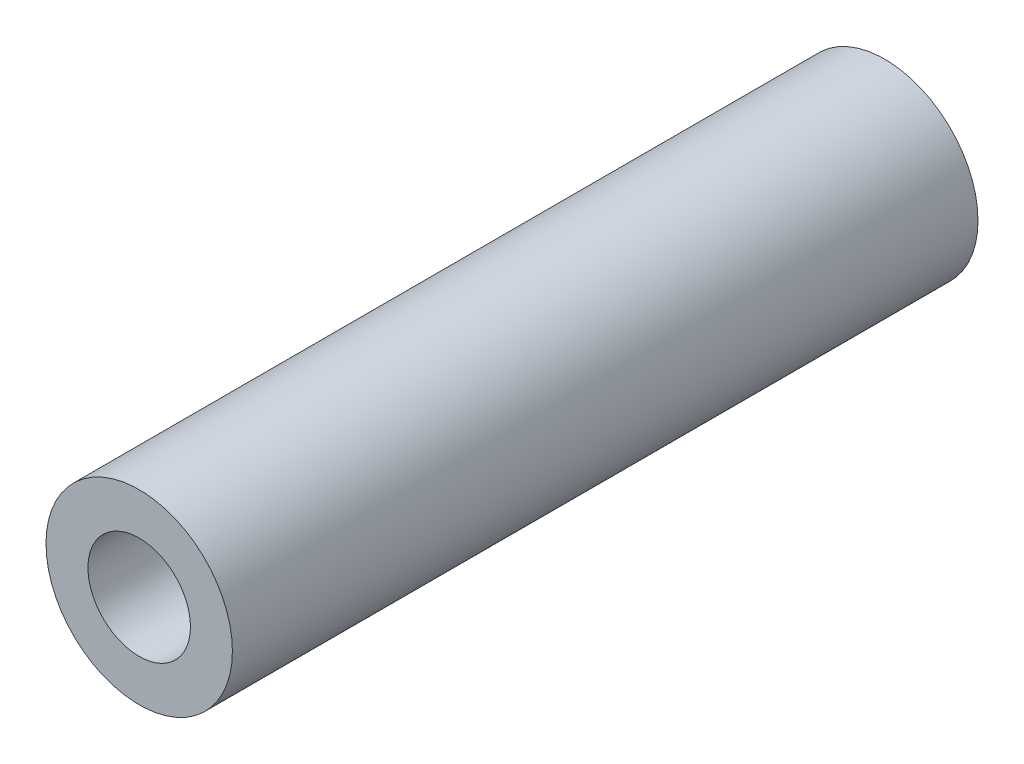
ISO-10303-21;
HEADER;
FILE_DESCRIPTION(('STEP AP214'),'2;1');
FILE_NAME('part.step','',(''),(''),'','','');
FILE_SCHEMA(('AUTOMOTIVE_DESIGN { 1 0 10303 214 1 1 1 1 }'));
ENDSEC;
DATA;
#1=APPLICATION_CONTEXT('core data for automotive mechanical design processes');
#2=APPLICATION_PROTOCOL_DEFINITION('international standard','automotive_design',2000,#1);
#3=PRODUCT_CONTEXT('',#1,'mechanical');
#4=PRODUCT('Part','Part','',(#3));
#5=PRODUCT_RELATED_PRODUCT_CATEGORY('part','',(#4));
#6=PRODUCT_DEFINITION_FORMATION('','',#4);
#7=PRODUCT_DEFINITION_CONTEXT('part definition',#1,'design');
#8=PRODUCT_DEFINITION('design','',#6,#7);
#9=PRODUCT_DEFINITION_SHAPE('','',#8);
#10=(LENGTH_UNIT() NAMED_UNIT(*) SI_UNIT(.MILLI.,.METRE.));
#11=(NAMED_UNIT(*) PLANE_ANGLE_UNIT() SI_UNIT($,.RADIAN.));
#12=(NAMED_UNIT(*) SI_UNIT($,.STERADIAN.) SOLID_ANGLE_UNIT());
#13=UNCERTAINTY_MEASURE_WITH_UNIT(LENGTH_MEASURE(1.E-05),#10,'distance_accuracy_value','');
#14=(GEOMETRIC_REPRESENTATION_CONTEXT(3) GLOBAL_UNCERTAINTY_ASSIGNED_CONTEXT((#13)) GLOBAL_UNIT_ASSIGNED_CONTEXT((#10,
#11,#12)) REPRESENTATION_CONTEXT('',''));
#15=CARTESIAN_POINT('',(0.,0.,0.));
#16=DIRECTION('',(0.,0.,1.));
#17=DIRECTION('',(1.,0.,0.));
#18=AXIS2_PLACEMENT_3D('',#15,#16,#17);
#19=CARTESIAN_POINT('',(0.,0.,12.));
#20=DIRECTION('',(0.,0.,1.));
#21=DIRECTION('',(1.,0.,0.));
#22=AXIS2_PLACEMENT_3D('',#19,#20,#21);
#23=PLANE('',#22);
#24=CARTESIAN_POINT('',(0.,0.,12.));
#25=DIRECTION('',(0.,0.,1.));
#26=DIRECTION('',(1.,0.,0.));
#27=AXIS2_PLACEMENT_3D('',#24,#25,#26);
#28=CIRCLE('',#27,3.);
#29=CARTESIAN_POINT('',(3.,0.,12.));
#30=VERTEX_POINT('',#29);
#31=EDGE_CURVE('E10',#30,#30,#28,.T.);
#32=ORIENTED_EDGE('',*,*,#31,.T.);
#33=EDGE_LOOP('',(#32));
#34=FACE_BOUND('',#33,.T.);
#35=CARTESIAN_POINT('',(0.,0.,12.));
#36=DIRECTION('',(0.,0.,1.));
#37=DIRECTION('',(1.,0.,0.));
#38=AXIS2_PLACEMENT_3D('',#35,#36,#37);
#39=CIRCLE('',#38,1.65);
#40=CARTESIAN_POINT('',(1.65,0.,12.));
#41=VERTEX_POINT('',#40);
#42=EDGE_CURVE('E48',#41,#41,#39,.T.);
#43=ORIENTED_EDGE('',*,*,#42,.F.);
#44=EDGE_LOOP('',(#43));
#45=FACE_BOUND('',#44,.T.);
#46=ADVANCED_FACE('F40',(#34,#45),#23,.T.);
#47=CARTESIAN_POINT('',(0.,0.,-12.));
#48=DIRECTION('',(0.,0.,1.));
#49=DIRECTION('',(1.,0.,0.));
#50=AXIS2_PLACEMENT_3D('',#47,#48,#49);
#51=PLANE('',#50);
#52=CARTESIAN_POINT('',(0.,0.,-12.));
#53=DIRECTION('',(0.,0.,1.));
#54=DIRECTION('',(1.,0.,0.));
#55=AXIS2_PLACEMENT_3D('',#52,#53,#54);
#56=CIRCLE('',#55,3.);
#57=CARTESIAN_POINT('',(3.,0.,-12.));
#58=VERTEX_POINT('',#57);
#59=EDGE_CURVE('E41',#58,#58,#56,.T.);
#60=ORIENTED_EDGE('',*,*,#59,.F.);
#61=EDGE_LOOP('',(#60));
#62=FACE_BOUND('',#61,.T.);
#63=CARTESIAN_POINT('',(0.,0.,-12.));
#64=DIRECTION('',(0.,0.,1.));
#65=DIRECTION('',(1.,0.,0.));
#66=AXIS2_PLACEMENT_3D('',#63,#64,#65);
#67=CIRCLE('',#66,1.65);
#68=CARTESIAN_POINT('',(1.65,0.,-12.));
#69=VERTEX_POINT('',#68);
#70=EDGE_CURVE('E49',#69,#69,#67,.T.);
#71=ORIENTED_EDGE('',*,*,#70,.T.);
#72=EDGE_LOOP('',(#71));
#73=FACE_BOUND('',#72,.T.);
#74=ADVANCED_FACE('F58',(#62,#73),#51,.F.);
#75=CARTESIAN_POINT('',(0.,0.,12.));
#76=DIRECTION('',(0.,0.,-1.));
#77=DIRECTION('',(-1.,0.,0.));
#78=AXIS2_PLACEMENT_3D('',#75,#76,#77);
#79=CYLINDRICAL_SURFACE('',#78,3.);
#80=ORIENTED_EDGE('',*,*,#31,.F.);
#81=EDGE_LOOP('',(#80));
#82=FACE_BOUND('',#81,.T.);
#83=ORIENTED_EDGE('',*,*,#59,.T.);
#84=EDGE_LOOP('',(#83));
#85=FACE_BOUND('',#84,.T.);
#86=ADVANCED_FACE('F39',(#82,#85),#79,.T.);
#87=CARTESIAN_POINT('',(0.,0.,12.));
#88=DIRECTION('',(0.,0.,-1.));
#89=DIRECTION('',(-1.,0.,0.));
#90=AXIS2_PLACEMENT_3D('',#87,#88,#89);
#91=CYLINDRICAL_SURFACE('',#90,1.65);
#92=ORIENTED_EDGE('',*,*,#42,.T.);
#93=EDGE_LOOP('',(#92));
#94=FACE_BOUND('',#93,.T.);
#95=ORIENTED_EDGE('',*,*,#70,.F.);
#96=EDGE_LOOP('',(#95));
#97=FACE_BOUND('',#96,.T.);
#98=ADVANCED_FACE('F57',(#94,#97),#91,.F.);
#99=CLOSED_SHELL('',(#46,#74,#86,#98));
#100=MANIFOLD_SOLID_BREP('B2',#99);
#101=ADVANCED_BREP_SHAPE_REPRESENTATION('',(#18,#100),#14);
#102=SHAPE_DEFINITION_REPRESENTATION(#9,#101);
ENDSEC;
END-ISO-10303-21;
